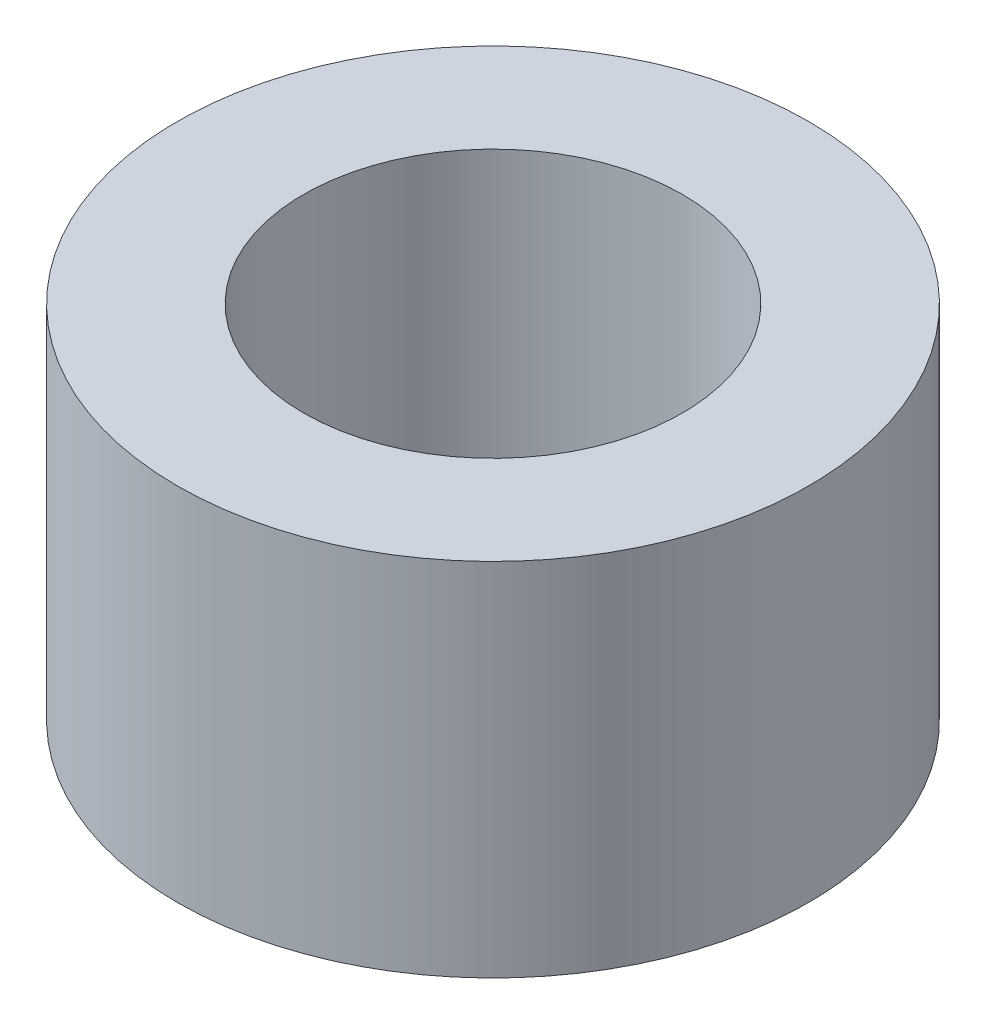
ISO-10303-21;
HEADER;
FILE_DESCRIPTION(('STEP AP214'),'2;1');
FILE_NAME('part.step','',(''),(''),'','','');
FILE_SCHEMA(('AUTOMOTIVE_DESIGN { 1 0 10303 214 1 1 1 1 }'));
ENDSEC;
DATA;
#1=APPLICATION_CONTEXT('core data for automotive mechanical design processes');
#2=APPLICATION_PROTOCOL_DEFINITION('international standard','automotive_design',2000,#1);
#3=PRODUCT_CONTEXT('',#1,'mechanical');
#4=PRODUCT('Part','Part','',(#3));
#5=PRODUCT_RELATED_PRODUCT_CATEGORY('part','',(#4));
#6=PRODUCT_DEFINITION_FORMATION('','',#4);
#7=PRODUCT_DEFINITION_CONTEXT('part definition',#1,'design');
#8=PRODUCT_DEFINITION('design','',#6,#7);
#9=PRODUCT_DEFINITION_SHAPE('','',#8);
#10=(LENGTH_UNIT() NAMED_UNIT(*) SI_UNIT(.MILLI.,.METRE.));
#11=(NAMED_UNIT(*) PLANE_ANGLE_UNIT() SI_UNIT($,.RADIAN.));
#12=(NAMED_UNIT(*) SI_UNIT($,.STERADIAN.) SOLID_ANGLE_UNIT());
#13=UNCERTAINTY_MEASURE_WITH_UNIT(LENGTH_MEASURE(1.E-05),#10,'distance_accuracy_value','');
#14=(GEOMETRIC_REPRESENTATION_CONTEXT(3) GLOBAL_UNCERTAINTY_ASSIGNED_CONTEXT((#13)) GLOBAL_UNIT_ASSIGNED_CONTEXT((#10,
#11,#12)) REPRESENTATION_CONTEXT('',''));
#15=CARTESIAN_POINT('',(0.,0.,0.));
#16=DIRECTION('',(0.,0.,1.));
#17=DIRECTION('',(1.,0.,0.));
#18=AXIS2_PLACEMENT_3D('',#15,#16,#17);
#19=CARTESIAN_POINT('',(0.,4.,0.));
#20=DIRECTION('',(0.,1.,0.));
#21=DIRECTION('',(0.,0.,1.));
#22=AXIS2_PLACEMENT_3D('',#19,#20,#21);
#23=PLANE('',#22);
#24=CARTESIAN_POINT('',(0.,4.,0.));
#25=DIRECTION('',(0.,1.,0.));
#26=DIRECTION('',(0.,0.,1.));
#27=AXIS2_PLACEMENT_3D('',#24,#25,#26);
#28=CIRCLE('',#27,3.5);
#29=CARTESIAN_POINT('',(0.,4.,3.5));
#30=VERTEX_POINT('',#29);
#31=EDGE_CURVE('E10',#30,#30,#28,.T.);
#32=ORIENTED_EDGE('',*,*,#31,.T.);
#33=EDGE_LOOP('',(#32));
#34=FACE_BOUND('',#33,.T.);
#35=CARTESIAN_POINT('',(0.,4.,0.));
#36=DIRECTION('',(0.,1.,0.));
#37=DIRECTION('',(0.,0.,1.));
#38=AXIS2_PLACEMENT_3D('',#35,#36,#37);
#39=CIRCLE('',#38,2.1);
#40=CARTESIAN_POINT('',(0.,4.,2.1));
#41=VERTEX_POINT('',#40);
#42=EDGE_CURVE('E50',#41,#41,#39,.T.);
#43=ORIENTED_EDGE('',*,*,#42,.F.);
#44=EDGE_LOOP('',(#43));
#45=FACE_BOUND('',#44,.T.);
#46=ADVANCED_FACE('F39',(#34,#45),#23,.T.);
#47=CARTESIAN_POINT('',(0.,0.,0.));
#48=DIRECTION('',(0.,1.,0.));
#49=DIRECTION('',(0.,0.,1.));
#50=AXIS2_PLACEMENT_3D('',#47,#48,#49);
#51=PLANE('',#50);
#52=CARTESIAN_POINT('',(0.,0.,0.));
#53=DIRECTION('',(0.,1.,0.));
#54=DIRECTION('',(0.,0.,1.));
#55=AXIS2_PLACEMENT_3D('',#52,#53,#54);
#56=CIRCLE('',#55,3.5);
#57=CARTESIAN_POINT('',(0.,0.,3.5));
#58=VERTEX_POINT('',#57);
#59=EDGE_CURVE('E43',#58,#58,#56,.T.);
#60=ORIENTED_EDGE('',*,*,#59,.F.);
#61=EDGE_LOOP('',(#60));
#62=FACE_BOUND('',#61,.T.);
#63=CARTESIAN_POINT('',(0.,0.,0.));
#64=DIRECTION('',(0.,1.,0.));
#65=DIRECTION('',(0.,0.,1.));
#66=AXIS2_PLACEMENT_3D('',#63,#64,#65);
#67=CIRCLE('',#66,2.1);
#68=CARTESIAN_POINT('',(0.,0.,2.1));
#69=VERTEX_POINT('',#68);
#70=EDGE_CURVE('E52',#69,#69,#67,.T.);
#71=ORIENTED_EDGE('',*,*,#70,.T.);
#72=EDGE_LOOP('',(#71));
#73=FACE_BOUND('',#72,.T.);
#74=ADVANCED_FACE('F62',(#62,#73),#51,.F.);
#75=CARTESIAN_POINT('',(0.,4.,0.));
#76=DIRECTION('',(0.,-1.,0.));
#77=DIRECTION('',(0.,0.,-1.));
#78=AXIS2_PLACEMENT_3D('',#75,#76,#77);
#79=CYLINDRICAL_SURFACE('',#78,3.5);
#80=ORIENTED_EDGE('',*,*,#31,.F.);
#81=EDGE_LOOP('',(#80));
#82=FACE_BOUND('',#81,.T.);
#83=ORIENTED_EDGE('',*,*,#59,.T.);
#84=EDGE_LOOP('',(#83));
#85=FACE_BOUND('',#84,.T.);
#86=ADVANCED_FACE('F41',(#82,#85),#79,.T.);
#87=CARTESIAN_POINT('',(0.,4.,0.));
#88=DIRECTION('',(0.,-1.,0.));
#89=DIRECTION('',(0.,0.,-1.));
#90=AXIS2_PLACEMENT_3D('',#87,#88,#89);
#91=CYLINDRICAL_SURFACE('',#90,2.1);
#92=ORIENTED_EDGE('',*,*,#42,.T.);
#93=EDGE_LOOP('',(#92));
#94=FACE_BOUND('',#93,.T.);
#95=ORIENTED_EDGE('',*,*,#70,.F.);
#96=EDGE_LOOP('',(#95));
#97=FACE_BOUND('',#96,.T.);
#98=ADVANCED_FACE('F58',(#94,#97),#91,.F.);
#99=CLOSED_SHELL('',(#46,#74,#86,#98));
#100=MANIFOLD_SOLID_BREP('B2',#99);
#101=ADVANCED_BREP_SHAPE_REPRESENTATION('',(#18,#100),#14);
#102=SHAPE_DEFINITION_REPRESENTATION(#9,#101);
ENDSEC;
END-ISO-10303-21;
